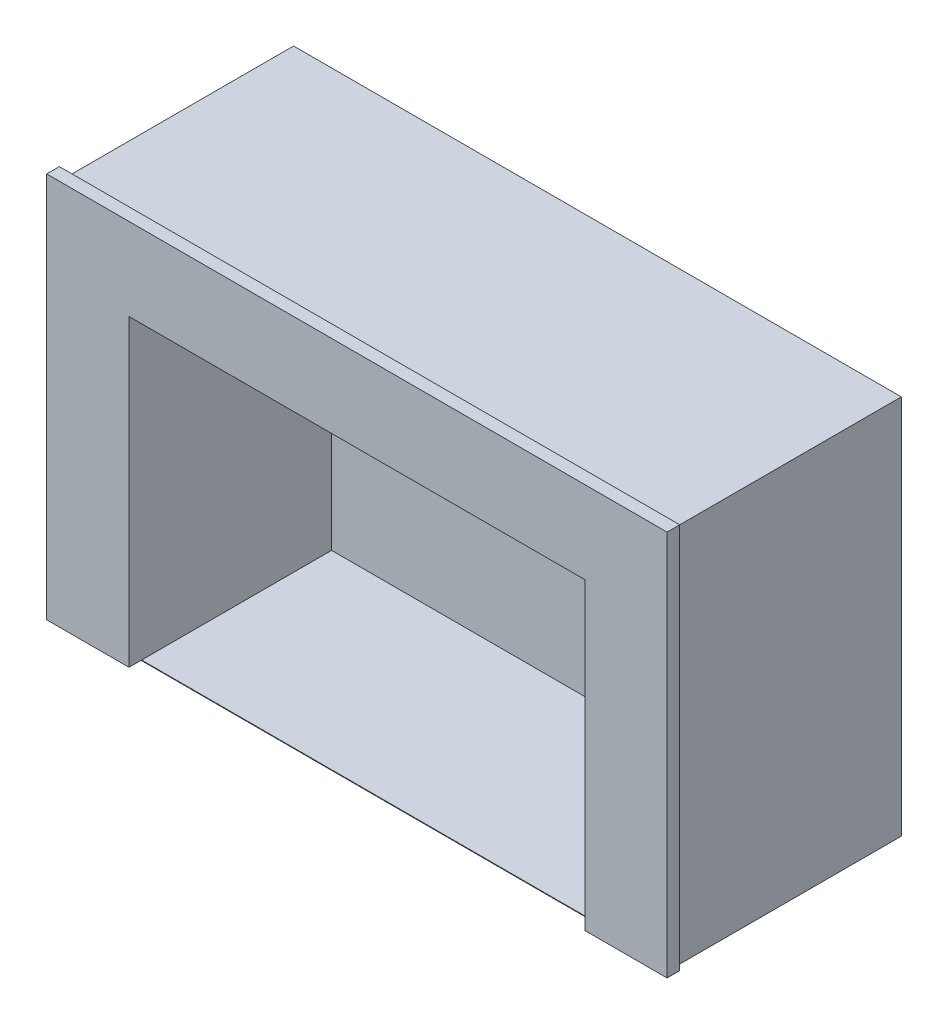
ISO-10303-21;
HEADER;
FILE_DESCRIPTION(('STEP AP214'),'2;1');
FILE_NAME('part.step','',(''),(''),'','','');
FILE_SCHEMA(('AUTOMOTIVE_DESIGN { 1 0 10303 214 1 1 1 1 }'));
ENDSEC;
DATA;
#1=APPLICATION_CONTEXT('core data for automotive mechanical design processes');
#2=APPLICATION_PROTOCOL_DEFINITION('international standard','automotive_design',2000,#1);
#3=PRODUCT_CONTEXT('',#1,'mechanical');
#4=PRODUCT('Part','Part','',(#3));
#5=PRODUCT_RELATED_PRODUCT_CATEGORY('part','',(#4));
#6=PRODUCT_DEFINITION_FORMATION('','',#4);
#7=PRODUCT_DEFINITION_CONTEXT('part definition',#1,'design');
#8=PRODUCT_DEFINITION('design','',#6,#7);
#9=PRODUCT_DEFINITION_SHAPE('','',#8);
#10=(LENGTH_UNIT() NAMED_UNIT(*) SI_UNIT(.MILLI.,.METRE.));
#11=(NAMED_UNIT(*) PLANE_ANGLE_UNIT() SI_UNIT($,.RADIAN.));
#12=(NAMED_UNIT(*) SI_UNIT($,.STERADIAN.) SOLID_ANGLE_UNIT());
#13=UNCERTAINTY_MEASURE_WITH_UNIT(LENGTH_MEASURE(1.E-05),#10,'distance_accuracy_value','');
#14=(GEOMETRIC_REPRESENTATION_CONTEXT(3) GLOBAL_UNCERTAINTY_ASSIGNED_CONTEXT((#13)) GLOBAL_UNIT_ASSIGNED_CONTEXT((#10,
#11,#12)) REPRESENTATION_CONTEXT('',''));
#15=CARTESIAN_POINT('',(0.,0.,0.));
#16=DIRECTION('',(0.,0.,1.));
#17=DIRECTION('',(1.,0.,0.));
#18=AXIS2_PLACEMENT_3D('',#15,#16,#17);
#19=CARTESIAN_POINT('',(-1219.2,1524.,-762.));
#20=DIRECTION('',(-1.,0.,0.));
#21=DIRECTION('',(0.,-1.,0.));
#22=AXIS2_PLACEMENT_3D('',#19,#20,#21);
#23=PLANE('',#22);
#24=DIRECTION('',(0.,-1.,0.));
#25=VECTOR('',#24,1.);
#26=CARTESIAN_POINT('',(-1219.2,1524.,0.));
#27=LINE('',#26,#25);
#28=CARTESIAN_POINT('',(-1219.2,1524.,0.));
#29=VERTEX_POINT('',#28);
#30=CARTESIAN_POINT('',(-1219.2,0.,0.));
#31=VERTEX_POINT('',#30);
#32=EDGE_CURVE('E105',#29,#31,#27,.T.);
#33=ORIENTED_EDGE('',*,*,#32,.F.);
#34=DIRECTION('',(0.,0.,1.));
#35=VECTOR('',#34,1.);
#36=CARTESIAN_POINT('',(-1219.2,1524.,-762.));
#37=LINE('',#36,#35);
#38=CARTESIAN_POINT('',(-1219.2,1524.,-914.4));
#39=VERTEX_POINT('',#38);
#40=EDGE_CURVE('E41',#39,#29,#37,.T.);
#41=ORIENTED_EDGE('',*,*,#40,.F.);
#42=DIRECTION('',(0.,1.,0.));
#43=VECTOR('',#42,1.);
#44=CARTESIAN_POINT('',(-1219.2,1524.,-914.4));
#45=LINE('',#44,#43);
#46=CARTESIAN_POINT('',(-1219.2,-2.54,-914.4));
#47=VERTEX_POINT('',#46);
#48=EDGE_CURVE('E144',#47,#39,#45,.T.);
#49=ORIENTED_EDGE('',*,*,#48,.F.);
#50=DIRECTION('',(0.,0.,-1.));
#51=VECTOR('',#50,1.);
#52=CARTESIAN_POINT('',(-1219.2,-2.54,-914.4));
#53=LINE('',#52,#51);
#54=CARTESIAN_POINT('',(-1219.2,-2.54,0.));
#55=VERTEX_POINT('',#54);
#56=EDGE_CURVE('E154',#55,#47,#53,.T.);
#57=ORIENTED_EDGE('',*,*,#56,.F.);
#58=EDGE_CURVE('E108',#31,#55,#27,.T.);
#59=ORIENTED_EDGE('',*,*,#58,.F.);
#60=EDGE_LOOP('',(#33,#41,#49,#57,#59));
#61=FACE_BOUND('',#60,.T.);
#62=ADVANCED_FACE('F33',(#61),#23,.T.);
#63=CARTESIAN_POINT('',(1219.2,1524.,-762.));
#64=DIRECTION('',(0.,1.,0.));
#65=DIRECTION('',(-1.,0.,0.));
#66=AXIS2_PLACEMENT_3D('',#63,#64,#65);
#67=PLANE('',#66);
#68=DIRECTION('',(-1.,0.,0.));
#69=VECTOR('',#68,1.);
#70=CARTESIAN_POINT('',(1219.2,1524.,0.));
#71=LINE('',#70,#69);
#72=CARTESIAN_POINT('',(1219.2,1524.,0.));
#73=VERTEX_POINT('',#72);
#74=EDGE_CURVE('E91',#73,#29,#71,.T.);
#75=ORIENTED_EDGE('',*,*,#74,.F.);
#76=DIRECTION('',(0.,0.,1.));
#77=VECTOR('',#76,1.);
#78=CARTESIAN_POINT('',(1219.2,1524.,-762.));
#79=LINE('',#78,#77);
#80=CARTESIAN_POINT('',(1219.2,1524.,-914.4));
#81=VERTEX_POINT('',#80);
#82=EDGE_CURVE('E73',#81,#73,#79,.T.);
#83=ORIENTED_EDGE('',*,*,#82,.F.);
#84=DIRECTION('',(1.,0.,0.));
#85=VECTOR('',#84,1.);
#86=CARTESIAN_POINT('',(1219.2,1524.,-914.4));
#87=LINE('',#86,#85);
#88=EDGE_CURVE('E142',#39,#81,#87,.T.);
#89=ORIENTED_EDGE('',*,*,#88,.F.);
#90=ORIENTED_EDGE('',*,*,#40,.T.);
#91=EDGE_LOOP('',(#75,#83,#89,#90));
#92=FACE_BOUND('',#91,.T.);
#93=ADVANCED_FACE('F92',(#92),#67,.T.);
#94=CARTESIAN_POINT('',(1219.2,0.,-762.));
#95=DIRECTION('',(1.,0.,0.));
#96=DIRECTION('',(0.,0.,-1.));
#97=AXIS2_PLACEMENT_3D('',#94,#95,#96);
#98=PLANE('',#97);
#99=DIRECTION('',(0.,1.,0.));
#100=VECTOR('',#99,1.);
#101=CARTESIAN_POINT('',(1219.2,0.,0.));
#102=LINE('',#101,#100);
#103=CARTESIAN_POINT('',(1219.2,-2.54,0.));
#104=VERTEX_POINT('',#103);
#105=CARTESIAN_POINT('',(1219.2,0.,0.));
#106=VERTEX_POINT('',#105);
#107=EDGE_CURVE('E98',#104,#106,#102,.T.);
#108=ORIENTED_EDGE('',*,*,#107,.F.);
#109=DIRECTION('',(0.,0.,1.));
#110=VECTOR('',#109,1.);
#111=CARTESIAN_POINT('',(1219.2,-2.54,-914.4));
#112=LINE('',#111,#110);
#113=CARTESIAN_POINT('',(1219.2,-2.54,-914.4));
#114=VERTEX_POINT('',#113);
#115=EDGE_CURVE('E150',#114,#104,#112,.T.);
#116=ORIENTED_EDGE('',*,*,#115,.F.);
#117=DIRECTION('',(0.,-1.,0.));
#118=VECTOR('',#117,1.);
#119=CARTESIAN_POINT('',(1219.2,1524.,-914.4));
#120=LINE('',#119,#118);
#121=EDGE_CURVE('E84',#81,#114,#120,.T.);
#122=ORIENTED_EDGE('',*,*,#121,.F.);
#123=ORIENTED_EDGE('',*,*,#82,.T.);
#124=EDGE_CURVE('E79',#106,#73,#102,.T.);
#125=ORIENTED_EDGE('',*,*,#124,.F.);
#126=EDGE_LOOP('',(#108,#116,#122,#123,#125));
#127=FACE_BOUND('',#126,.T.);
#128=ADVANCED_FACE('F76',(#127),#98,.T.);
#129=CARTESIAN_POINT('',(914.4,1219.2,-762.));
#130=DIRECTION('',(-1.,0.,0.));
#131=DIRECTION('',(0.,-1.,0.));
#132=AXIS2_PLACEMENT_3D('',#129,#130,#131);
#133=PLANE('',#132);
#134=DIRECTION('',(0.,0.,1.));
#135=VECTOR('',#134,1.);
#136=CARTESIAN_POINT('',(914.4,0.,-762.));
#137=LINE('',#136,#135);
#138=CARTESIAN_POINT('',(914.4,0.,-762.));
#139=VERTEX_POINT('',#138);
#140=CARTESIAN_POINT('',(914.4,0.,0.));
#141=VERTEX_POINT('',#140);
#142=EDGE_CURVE('E88',#139,#141,#137,.T.);
#143=ORIENTED_EDGE('',*,*,#142,.T.);
#144=DIRECTION('',(0.,0.,-1.));
#145=VECTOR('',#144,1.);
#146=CARTESIAN_POINT('',(914.4,0.,50.8));
#147=LINE('',#146,#145);
#148=CARTESIAN_POINT('',(914.4,0.,50.8));
#149=VERTEX_POINT('',#148);
#150=EDGE_CURVE('E151',#149,#141,#147,.T.);
#151=ORIENTED_EDGE('',*,*,#150,.F.);
#152=DIRECTION('',(0.,-1.,0.));
#153=VECTOR('',#152,1.);
#154=CARTESIAN_POINT('',(914.4,1219.2,50.8));
#155=LINE('',#154,#153);
#156=CARTESIAN_POINT('',(914.4,1219.2,50.8));
#157=VERTEX_POINT('',#156);
#158=EDGE_CURVE('E207',#157,#149,#155,.T.);
#159=ORIENTED_EDGE('',*,*,#158,.F.);
#160=DIRECTION('',(0.,0.,1.));
#161=VECTOR('',#160,1.);
#162=CARTESIAN_POINT('',(914.4,1219.2,-762.));
#163=LINE('',#162,#161);
#164=CARTESIAN_POINT('',(914.4,1219.2,-762.));
#165=VERTEX_POINT('',#164);
#166=EDGE_CURVE('E115',#165,#157,#163,.T.);
#167=ORIENTED_EDGE('',*,*,#166,.F.);
#168=DIRECTION('',(0.,-1.,0.));
#169=VECTOR('',#168,1.);
#170=CARTESIAN_POINT('',(914.4,1219.2,-762.));
#171=LINE('',#170,#169);
#172=EDGE_CURVE('E125',#165,#139,#171,.T.);
#173=ORIENTED_EDGE('',*,*,#172,.T.);
#174=EDGE_LOOP('',(#143,#151,#159,#167,#173));
#175=FACE_BOUND('',#174,.T.);
#176=ADVANCED_FACE('F254',(#175),#133,.T.);
#177=CARTESIAN_POINT('',(-914.4,1219.2,-762.));
#178=DIRECTION('',(0.,-1.,0.));
#179=DIRECTION('',(0.,0.,-1.));
#180=AXIS2_PLACEMENT_3D('',#177,#178,#179);
#181=PLANE('',#180);
#182=ORIENTED_EDGE('',*,*,#166,.T.);
#183=DIRECTION('',(1.,0.,0.));
#184=VECTOR('',#183,1.);
#185=CARTESIAN_POINT('',(-914.4,1219.2,50.8));
#186=LINE('',#185,#184);
#187=CARTESIAN_POINT('',(-914.4,1219.2,50.8));
#188=VERTEX_POINT('',#187);
#189=EDGE_CURVE('E210',#188,#157,#186,.T.);
#190=ORIENTED_EDGE('',*,*,#189,.F.);
#191=DIRECTION('',(0.,0.,1.));
#192=VECTOR('',#191,1.);
#193=CARTESIAN_POINT('',(-914.4,1219.2,-762.));
#194=LINE('',#193,#192);
#195=CARTESIAN_POINT('',(-914.4,1219.2,-762.));
#196=VERTEX_POINT('',#195);
#197=EDGE_CURVE('E117',#196,#188,#194,.T.);
#198=ORIENTED_EDGE('',*,*,#197,.F.);
#199=DIRECTION('',(1.,0.,0.));
#200=VECTOR('',#199,1.);
#201=CARTESIAN_POINT('',(-914.4,1219.2,-762.));
#202=LINE('',#201,#200);
#203=EDGE_CURVE('E57',#196,#165,#202,.T.);
#204=ORIENTED_EDGE('',*,*,#203,.T.);
#205=EDGE_LOOP('',(#182,#190,#198,#204));
#206=FACE_BOUND('',#205,.T.);
#207=ADVANCED_FACE('F257',(#206),#181,.T.);
#208=CARTESIAN_POINT('',(-914.4,0.,-762.));
#209=DIRECTION('',(1.,0.,0.));
#210=DIRECTION('',(0.,0.,-1.));
#211=AXIS2_PLACEMENT_3D('',#208,#209,#210);
#212=PLANE('',#211);
#213=ORIENTED_EDGE('',*,*,#197,.T.);
#214=DIRECTION('',(0.,1.,0.));
#215=VECTOR('',#214,1.);
#216=CARTESIAN_POINT('',(-914.4,1219.2,50.8));
#217=LINE('',#216,#215);
#218=CARTESIAN_POINT('',(-914.4,0.,50.8));
#219=VERTEX_POINT('',#218);
#220=EDGE_CURVE('E181',#219,#188,#217,.T.);
#221=ORIENTED_EDGE('',*,*,#220,.F.);
#222=DIRECTION('',(0.,0.,-1.));
#223=VECTOR('',#222,1.);
#224=CARTESIAN_POINT('',(-914.4,0.,50.8));
#225=LINE('',#224,#223);
#226=CARTESIAN_POINT('',(-914.4,0.,0.));
#227=VERTEX_POINT('',#226);
#228=EDGE_CURVE('E176',#219,#227,#225,.T.);
#229=ORIENTED_EDGE('',*,*,#228,.T.);
#230=DIRECTION('',(0.,0.,1.));
#231=VECTOR('',#230,1.);
#232=CARTESIAN_POINT('',(-914.4,0.,-762.));
#233=LINE('',#232,#231);
#234=CARTESIAN_POINT('',(-914.4,0.,-762.));
#235=VERTEX_POINT('',#234);
#236=EDGE_CURVE('E36',#235,#227,#233,.T.);
#237=ORIENTED_EDGE('',*,*,#236,.F.);
#238=DIRECTION('',(0.,1.,0.));
#239=VECTOR('',#238,1.);
#240=CARTESIAN_POINT('',(-914.4,0.,-762.));
#241=LINE('',#240,#239);
#242=EDGE_CURVE('E97',#235,#196,#241,.T.);
#243=ORIENTED_EDGE('',*,*,#242,.T.);
#244=EDGE_LOOP('',(#213,#221,#229,#237,#243));
#245=FACE_BOUND('',#244,.T.);
#246=ADVANCED_FACE('F223',(#245),#212,.T.);
#247=CARTESIAN_POINT('',(0.,0.,0.));
#248=DIRECTION('',(0.,0.,1.));
#249=DIRECTION('',(1.,0.,0.));
#250=AXIS2_PLACEMENT_3D('',#247,#248,#249);
#251=PLANE('',#250);
#252=DIRECTION('',(1.,0.,0.));
#253=VECTOR('',#252,1.);
#254=CARTESIAN_POINT('',(-914.4,0.,0.));
#255=LINE('',#254,#253);
#256=EDGE_CURVE('E11',#31,#227,#255,.T.);
#257=ORIENTED_EDGE('',*,*,#256,.F.);
#258=ORIENTED_EDGE('',*,*,#58,.T.);
#259=DIRECTION('',(-1.,0.,0.));
#260=VECTOR('',#259,1.);
#261=CARTESIAN_POINT('',(1219.2,-2.54,0.));
#262=LINE('',#261,#260);
#263=EDGE_CURVE('E157',#104,#55,#262,.T.);
#264=ORIENTED_EDGE('',*,*,#263,.F.);
#265=ORIENTED_EDGE('',*,*,#107,.T.);
#266=DIRECTION('',(1.,0.,0.));
#267=VECTOR('',#266,1.);
#268=CARTESIAN_POINT('',(914.4,0.,0.));
#269=LINE('',#268,#267);
#270=EDGE_CURVE('E191',#141,#106,#269,.T.);
#271=ORIENTED_EDGE('',*,*,#270,.F.);
#272=DIRECTION('',(-1.,0.,0.));
#273=VECTOR('',#272,1.);
#274=CARTESIAN_POINT('',(1219.2,0.,0.));
#275=LINE('',#274,#273);
#276=EDGE_CURVE('E148',#141,#227,#275,.T.);
#277=ORIENTED_EDGE('',*,*,#276,.T.);
#278=EDGE_LOOP('',(#257,#258,#264,#265,#271,#277));
#279=FACE_BOUND('',#278,.T.);
#280=ADVANCED_FACE('F288',(#279),#251,.T.);
#281=CARTESIAN_POINT('',(0.,0.,-914.4));
#282=DIRECTION('',(0.,0.,-1.));
#283=DIRECTION('',(-1.,0.,0.));
#284=AXIS2_PLACEMENT_3D('',#281,#282,#283);
#285=PLANE('',#284);
#286=ORIENTED_EDGE('',*,*,#121,.T.);
#287=DIRECTION('',(1.,0.,0.));
#288=VECTOR('',#287,1.);
#289=CARTESIAN_POINT('',(1219.2,-2.54,-914.4));
#290=LINE('',#289,#288);
#291=EDGE_CURVE('E141',#47,#114,#290,.T.);
#292=ORIENTED_EDGE('',*,*,#291,.F.);
#293=ORIENTED_EDGE('',*,*,#48,.T.);
#294=ORIENTED_EDGE('',*,*,#88,.T.);
#295=EDGE_LOOP('',(#286,#292,#293,#294));
#296=FACE_BOUND('',#295,.T.);
#297=ADVANCED_FACE('F322',(#296),#285,.T.);
#298=CARTESIAN_POINT('',(0.,0.,-762.));
#299=DIRECTION('',(0.,0.,-1.));
#300=DIRECTION('',(-1.,0.,0.));
#301=AXIS2_PLACEMENT_3D('',#298,#299,#300);
#302=PLANE('',#301);
#303=ORIENTED_EDGE('',*,*,#172,.F.);
#304=ORIENTED_EDGE('',*,*,#203,.F.);
#305=ORIENTED_EDGE('',*,*,#242,.F.);
#306=DIRECTION('',(-1.,0.,0.));
#307=VECTOR('',#306,1.);
#308=CARTESIAN_POINT('',(1219.2,0.,-762.));
#309=LINE('',#308,#307);
#310=EDGE_CURVE('E139',#139,#235,#309,.T.);
#311=ORIENTED_EDGE('',*,*,#310,.F.);
#312=EDGE_LOOP('',(#303,#304,#305,#311));
#313=FACE_BOUND('',#312,.T.);
#314=ADVANCED_FACE('F253',(#313),#302,.F.);
#315=CARTESIAN_POINT('',(0.,-2.54,0.));
#316=DIRECTION('',(0.,-1.,0.));
#317=DIRECTION('',(0.,0.,-1.));
#318=AXIS2_PLACEMENT_3D('',#315,#316,#317);
#319=PLANE('',#318);
#320=ORIENTED_EDGE('',*,*,#115,.T.);
#321=ORIENTED_EDGE('',*,*,#263,.T.);
#322=ORIENTED_EDGE('',*,*,#56,.T.);
#323=ORIENTED_EDGE('',*,*,#291,.T.);
#324=EDGE_LOOP('',(#320,#321,#322,#323));
#325=FACE_BOUND('',#324,.T.);
#326=ADVANCED_FACE('F290',(#325),#319,.T.);
#327=CARTESIAN_POINT('',(0.,0.,0.));
#328=DIRECTION('',(0.,-1.,0.));
#329=DIRECTION('',(0.,0.,-1.));
#330=AXIS2_PLACEMENT_3D('',#327,#328,#329);
#331=PLANE('',#330);
#332=ORIENTED_EDGE('',*,*,#142,.F.);
#333=ORIENTED_EDGE('',*,*,#310,.T.);
#334=ORIENTED_EDGE('',*,*,#236,.T.);
#335=ORIENTED_EDGE('',*,*,#276,.F.);
#336=EDGE_LOOP('',(#332,#333,#334,#335));
#337=FACE_BOUND('',#336,.T.);
#338=ADVANCED_FACE('F258',(#337),#331,.F.);
#339=CARTESIAN_POINT('',(914.4,0.,50.8));
#340=DIRECTION('',(0.,1.,0.));
#341=DIRECTION('',(0.,0.,1.));
#342=AXIS2_PLACEMENT_3D('',#339,#340,#341);
#343=PLANE('',#342);
#344=ORIENTED_EDGE('',*,*,#270,.T.);
#345=CARTESIAN_POINT('',(1244.6,0.,0.));
#346=VERTEX_POINT('',#345);
#347=EDGE_CURVE('E103',#106,#346,#269,.T.);
#348=ORIENTED_EDGE('',*,*,#347,.T.);
#349=DIRECTION('',(0.,0.,-1.));
#350=VECTOR('',#349,1.);
#351=CARTESIAN_POINT('',(1244.6,0.,50.8));
#352=LINE('',#351,#350);
#353=CARTESIAN_POINT('',(1244.6,0.,50.8));
#354=VERTEX_POINT('',#353);
#355=EDGE_CURVE('E164',#354,#346,#352,.T.);
#356=ORIENTED_EDGE('',*,*,#355,.F.);
#357=DIRECTION('',(1.,0.,0.));
#358=VECTOR('',#357,1.);
#359=CARTESIAN_POINT('',(914.4,0.,50.8));
#360=LINE('',#359,#358);
#361=EDGE_CURVE('E204',#149,#354,#360,.T.);
#362=ORIENTED_EDGE('',*,*,#361,.F.);
#363=ORIENTED_EDGE('',*,*,#150,.T.);
#364=EDGE_LOOP('',(#344,#348,#356,#362,#363));
#365=FACE_BOUND('',#364,.T.);
#366=ADVANCED_FACE('F265',(#365),#343,.F.);
#367=CARTESIAN_POINT('',(1244.6,0.,50.8));
#368=DIRECTION('',(-1.,0.,0.));
#369=DIRECTION('',(0.,0.,1.));
#370=AXIS2_PLACEMENT_3D('',#367,#368,#369);
#371=PLANE('',#370);
#372=DIRECTION('',(0.,1.,0.));
#373=VECTOR('',#372,1.);
#374=CARTESIAN_POINT('',(1244.6,0.,0.));
#375=LINE('',#374,#373);
#376=CARTESIAN_POINT('',(1244.6,1549.4,0.));
#377=VERTEX_POINT('',#376);
#378=EDGE_CURVE('E188',#346,#377,#375,.T.);
#379=ORIENTED_EDGE('',*,*,#378,.T.);
#380=DIRECTION('',(0.,0.,-1.));
#381=VECTOR('',#380,1.);
#382=CARTESIAN_POINT('',(1244.6,1549.4,50.8));
#383=LINE('',#382,#381);
#384=CARTESIAN_POINT('',(1244.6,1549.4,50.8));
#385=VERTEX_POINT('',#384);
#386=EDGE_CURVE('E167',#385,#377,#383,.T.);
#387=ORIENTED_EDGE('',*,*,#386,.F.);
#388=DIRECTION('',(0.,1.,0.));
#389=VECTOR('',#388,1.);
#390=CARTESIAN_POINT('',(1244.6,0.,50.8));
#391=LINE('',#390,#389);
#392=EDGE_CURVE('E201',#354,#385,#391,.T.);
#393=ORIENTED_EDGE('',*,*,#392,.F.);
#394=ORIENTED_EDGE('',*,*,#355,.T.);
#395=EDGE_LOOP('',(#379,#387,#393,#394));
#396=FACE_BOUND('',#395,.T.);
#397=ADVANCED_FACE('F293',(#396),#371,.F.);
#398=CARTESIAN_POINT('',(1244.6,1549.4,50.8));
#399=DIRECTION('',(0.,-1.,0.));
#400=DIRECTION('',(1.,0.,0.));
#401=AXIS2_PLACEMENT_3D('',#398,#399,#400);
#402=PLANE('',#401);
#403=DIRECTION('',(-1.,0.,0.));
#404=VECTOR('',#403,1.);
#405=CARTESIAN_POINT('',(1244.6,1549.4,0.));
#406=LINE('',#405,#404);
#407=CARTESIAN_POINT('',(-1244.6,1549.4,0.));
#408=VERTEX_POINT('',#407);
#409=EDGE_CURVE('E185',#377,#408,#406,.T.);
#410=ORIENTED_EDGE('',*,*,#409,.T.);
#411=DIRECTION('',(0.,0.,-1.));
#412=VECTOR('',#411,1.);
#413=CARTESIAN_POINT('',(-1244.6,1549.4,50.8));
#414=LINE('',#413,#412);
#415=CARTESIAN_POINT('',(-1244.6,1549.4,50.8));
#416=VERTEX_POINT('',#415);
#417=EDGE_CURVE('E170',#416,#408,#414,.T.);
#418=ORIENTED_EDGE('',*,*,#417,.F.);
#419=DIRECTION('',(-1.,0.,0.));
#420=VECTOR('',#419,1.);
#421=CARTESIAN_POINT('',(1244.6,1549.4,50.8));
#422=LINE('',#421,#420);
#423=EDGE_CURVE('E198',#385,#416,#422,.T.);
#424=ORIENTED_EDGE('',*,*,#423,.F.);
#425=ORIENTED_EDGE('',*,*,#386,.T.);
#426=EDGE_LOOP('',(#410,#418,#424,#425));
#427=FACE_BOUND('',#426,.T.);
#428=ADVANCED_FACE('F277',(#427),#402,.F.);
#429=CARTESIAN_POINT('',(-1244.6,1549.4,50.8));
#430=DIRECTION('',(1.,0.,0.));
#431=DIRECTION('',(0.,1.,0.));
#432=AXIS2_PLACEMENT_3D('',#429,#430,#431);
#433=PLANE('',#432);
#434=DIRECTION('',(0.,-1.,0.));
#435=VECTOR('',#434,1.);
#436=CARTESIAN_POINT('',(-1244.6,1549.4,0.));
#437=LINE('',#436,#435);
#438=CARTESIAN_POINT('',(-1244.6,0.,0.));
#439=VERTEX_POINT('',#438);
#440=EDGE_CURVE('E182',#408,#439,#437,.T.);
#441=ORIENTED_EDGE('',*,*,#440,.T.);
#442=DIRECTION('',(0.,0.,-1.));
#443=VECTOR('',#442,1.);
#444=CARTESIAN_POINT('',(-1244.6,0.,50.8));
#445=LINE('',#444,#443);
#446=CARTESIAN_POINT('',(-1244.6,0.,50.8));
#447=VERTEX_POINT('',#446);
#448=EDGE_CURVE('E173',#447,#439,#445,.T.);
#449=ORIENTED_EDGE('',*,*,#448,.F.);
#450=DIRECTION('',(0.,-1.,0.));
#451=VECTOR('',#450,1.);
#452=CARTESIAN_POINT('',(-1244.6,1549.4,50.8));
#453=LINE('',#452,#451);
#454=EDGE_CURVE('E195',#416,#447,#453,.T.);
#455=ORIENTED_EDGE('',*,*,#454,.F.);
#456=ORIENTED_EDGE('',*,*,#417,.T.);
#457=EDGE_LOOP('',(#441,#449,#455,#456));
#458=FACE_BOUND('',#457,.T.);
#459=ADVANCED_FACE('F281',(#458),#433,.F.);
#460=CARTESIAN_POINT('',(-914.4,0.,50.8));
#461=DIRECTION('',(0.,1.,0.));
#462=DIRECTION('',(0.,0.,1.));
#463=AXIS2_PLACEMENT_3D('',#460,#461,#462);
#464=PLANE('',#463);
#465=EDGE_CURVE('E43',#439,#31,#255,.T.);
#466=ORIENTED_EDGE('',*,*,#465,.T.);
#467=ORIENTED_EDGE('',*,*,#256,.T.);
#468=ORIENTED_EDGE('',*,*,#228,.F.);
#469=DIRECTION('',(1.,0.,0.));
#470=VECTOR('',#469,1.);
#471=CARTESIAN_POINT('',(-914.4,0.,50.8));
#472=LINE('',#471,#470);
#473=EDGE_CURVE('E178',#447,#219,#472,.T.);
#474=ORIENTED_EDGE('',*,*,#473,.F.);
#475=ORIENTED_EDGE('',*,*,#448,.T.);
#476=EDGE_LOOP('',(#466,#467,#468,#474,#475));
#477=FACE_BOUND('',#476,.T.);
#478=ADVANCED_FACE('F284',(#477),#464,.F.);
#479=CARTESIAN_POINT('',(0.,0.,50.8));
#480=DIRECTION('',(0.,0.,-1.));
#481=DIRECTION('',(-1.,0.,0.));
#482=AXIS2_PLACEMENT_3D('',#479,#480,#481);
#483=PLANE('',#482);
#484=ORIENTED_EDGE('',*,*,#220,.T.);
#485=ORIENTED_EDGE('',*,*,#189,.T.);
#486=ORIENTED_EDGE('',*,*,#158,.T.);
#487=ORIENTED_EDGE('',*,*,#361,.T.);
#488=ORIENTED_EDGE('',*,*,#392,.T.);
#489=ORIENTED_EDGE('',*,*,#423,.T.);
#490=ORIENTED_EDGE('',*,*,#454,.T.);
#491=ORIENTED_EDGE('',*,*,#473,.T.);
#492=EDGE_LOOP('',(#484,#485,#486,#487,#488,#489,#490,#491));
#493=FACE_BOUND('',#492,.T.);
#494=ADVANCED_FACE('F215',(#493),#483,.F.);
#495=CARTESIAN_POINT('',(0.,0.,0.));
#496=DIRECTION('',(0.,0.,-1.));
#497=DIRECTION('',(-1.,0.,0.));
#498=AXIS2_PLACEMENT_3D('',#495,#496,#497);
#499=PLANE('',#498);
#500=ORIENTED_EDGE('',*,*,#347,.F.);
#501=ORIENTED_EDGE('',*,*,#124,.T.);
#502=ORIENTED_EDGE('',*,*,#74,.T.);
#503=ORIENTED_EDGE('',*,*,#32,.T.);
#504=ORIENTED_EDGE('',*,*,#465,.F.);
#505=ORIENTED_EDGE('',*,*,#440,.F.);
#506=ORIENTED_EDGE('',*,*,#409,.F.);
#507=ORIENTED_EDGE('',*,*,#378,.F.);
#508=EDGE_LOOP('',(#500,#501,#502,#503,#504,#505,#506,#507));
#509=FACE_BOUND('',#508,.T.);
#510=ADVANCED_FACE('F100',(#509),#499,.T.);
#511=CLOSED_SHELL('',(#62,#93,#128,#176,#207,#246,#280,#297,#314,#326,#338,#366,#397,#428,#459,
#478,#494,#510));
#512=MANIFOLD_SOLID_BREP('B2',#511);
#513=ADVANCED_BREP_SHAPE_REPRESENTATION('',(#18,#512),#14);
#514=SHAPE_DEFINITION_REPRESENTATION(#9,#513);
ENDSEC;
END-ISO-10303-21;
